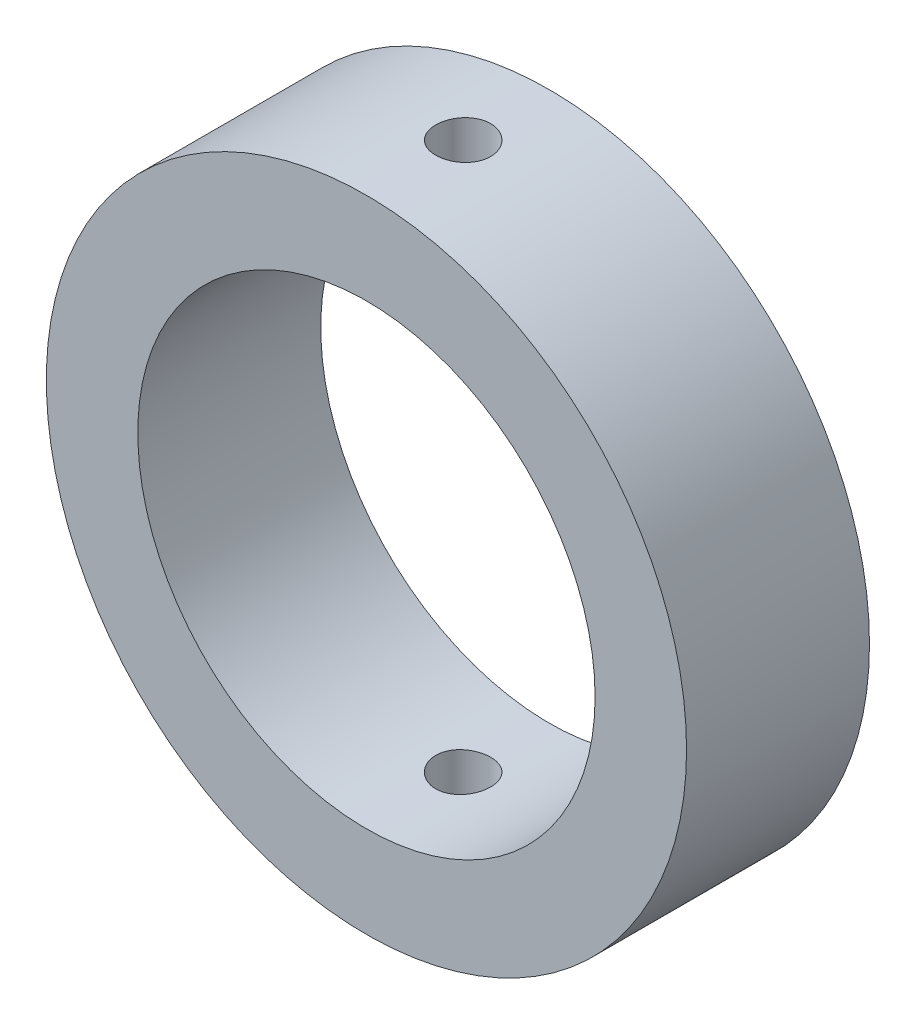
ISO-10303-21;
HEADER;
FILE_DESCRIPTION(('STEP AP214'),'2;1');
FILE_NAME('part.step','',(''),(''),'','','');
FILE_SCHEMA(('AUTOMOTIVE_DESIGN { 1 0 10303 214 1 1 1 1 }'));
ENDSEC;
DATA;
#1=APPLICATION_CONTEXT('core data for automotive mechanical design processes');
#2=APPLICATION_PROTOCOL_DEFINITION('international standard','automotive_design',2000,#1);
#3=PRODUCT_CONTEXT('',#1,'mechanical');
#4=PRODUCT('Part','Part','',(#3));
#5=PRODUCT_RELATED_PRODUCT_CATEGORY('part','',(#4));
#6=PRODUCT_DEFINITION_FORMATION('','',#4);
#7=PRODUCT_DEFINITION_CONTEXT('part definition',#1,'design');
#8=PRODUCT_DEFINITION('design','',#6,#7);
#9=PRODUCT_DEFINITION_SHAPE('','',#8);
#10=(LENGTH_UNIT() NAMED_UNIT(*) SI_UNIT(.MILLI.,.METRE.));
#11=(NAMED_UNIT(*) PLANE_ANGLE_UNIT() SI_UNIT($,.RADIAN.));
#12=(NAMED_UNIT(*) SI_UNIT($,.STERADIAN.) SOLID_ANGLE_UNIT());
#13=UNCERTAINTY_MEASURE_WITH_UNIT(LENGTH_MEASURE(1.E-05),#10,'distance_accuracy_value','');
#14=(GEOMETRIC_REPRESENTATION_CONTEXT(3) GLOBAL_UNCERTAINTY_ASSIGNED_CONTEXT((#13)) GLOBAL_UNIT_ASSIGNED_CONTEXT((#10,
#11,#12)) REPRESENTATION_CONTEXT('',''));
#15=CARTESIAN_POINT('',(0.,0.,0.));
#16=DIRECTION('',(0.,0.,1.));
#17=DIRECTION('',(1.,0.,0.));
#18=AXIS2_PLACEMENT_3D('',#15,#16,#17);
#19=CARTESIAN_POINT('',(0.,0.,20.));
#20=DIRECTION('',(0.,0.,-1.));
#21=DIRECTION('',(-1.,0.,0.));
#22=AXIS2_PLACEMENT_3D('',#19,#20,#21);
#23=CYLINDRICAL_SURFACE('',#22,35.);
#24=CARTESIAN_POINT('',(0.,0.,20.));
#25=DIRECTION('',(0.,0.,1.));
#26=DIRECTION('',(1.,0.,0.));
#27=AXIS2_PLACEMENT_3D('',#24,#25,#26);
#28=CIRCLE('',#27,35.);
#29=CARTESIAN_POINT('',(35.,0.,20.));
#30=VERTEX_POINT('',#29);
#31=EDGE_CURVE('E11',#30,#30,#28,.T.);
#32=ORIENTED_EDGE('',*,*,#31,.F.);
#33=EDGE_LOOP('',(#32));
#34=FACE_BOUND('',#33,.T.);
#35=CARTESIAN_POINT('',(0.,0.,0.));
#36=DIRECTION('',(0.,0.,1.));
#37=DIRECTION('',(1.,0.,0.));
#38=AXIS2_PLACEMENT_3D('',#35,#36,#37);
#39=CIRCLE('',#38,35.);
#40=CARTESIAN_POINT('',(35.,0.,0.));
#41=VERTEX_POINT('',#40);
#42=EDGE_CURVE('E69',#41,#41,#39,.T.);
#43=ORIENTED_EDGE('',*,*,#42,.T.);
#44=EDGE_LOOP('',(#43));
#45=FACE_BOUND('',#44,.T.);
#46=CARTESIAN_POINT('',(0.,-35.,6.42415591280614));
#47=CARTESIAN_POINT('',(0.168180177421425,-34.9999983189466,6.42416325069751));
#48=CARTESIAN_POINT('',(0.336474410694065,-34.9987748870089,6.43834577509294));
#49=CARTESIAN_POINT('',(0.668405276387218,-34.9940120055983,6.49471314657702));
#50=CARTESIAN_POINT('',(0.83203643352241,-34.9904699418268,6.53692960319824));
#51=CARTESIAN_POINT('',(1.14978580604665,-34.9814700099417,6.64813398195727));
#52=CARTESIAN_POINT('',(1.30390939390644,-34.9760132356579,6.71710662127546));
#53=CARTESIAN_POINT('',(1.5983553572425,-34.9637955952331,6.87983782876435));
#54=CARTESIAN_POINT('',(1.7386806487592,-34.9570350055299,6.97359114443867));
#55=CARTESIAN_POINT('',(2.00196024172095,-34.9429478698077,7.18349420175544));
#56=CARTESIAN_POINT('',(2.12487233650439,-34.9356200130702,7.29969679960563));
#57=CARTESIAN_POINT('',(2.34947428548936,-34.9212352148941,7.55108800216207));
#58=CARTESIAN_POINT('',(2.45116320107853,-34.9141782854488,7.68627744613488));
#59=CARTESIAN_POINT('',(2.63057608789142,-34.9011203668809,7.97206167374878));
#60=CARTESIAN_POINT('',(2.70826279885841,-34.895121025662,8.12267993080539));
#61=CARTESIAN_POINT('',(2.83722803822898,-34.8848727505605,8.43488280862855));
#62=CARTESIAN_POINT('',(2.88850705745045,-34.8806237841455,8.596467225513));
#63=CARTESIAN_POINT('',(2.96307845769353,-34.8743684880487,8.92559155709542));
#64=CARTESIAN_POINT('',(2.98643979537529,-34.8723566335604,9.09311574119376));
#65=CARTESIAN_POINT('',(3.00472573441206,-34.8707859372111,9.42971859713631));
#66=CARTESIAN_POINT('',(2.99965089755265,-34.8712270468893,9.59879723820475));
#67=CARTESIAN_POINT('',(2.96126551313284,-34.874507414771,9.93323656271367));
#68=CARTESIAN_POINT('',(2.92802995365881,-34.8773403039272,10.0986059241451));
#69=CARTESIAN_POINT('',(2.83438308452453,-34.8850750500347,10.4214104140507));
#70=CARTESIAN_POINT('',(2.77397149596722,-34.8899769282191,10.5788454610795));
#71=CARTESIAN_POINT('',(2.62760362876988,-34.9013046627491,10.8815510151968));
#72=CARTESIAN_POINT('',(2.54161375570937,-34.9077325210554,11.0268052003468));
#73=CARTESIAN_POINT('',(2.34655446417304,-34.9213861292491,11.3008472889814));
#74=CARTESIAN_POINT('',(2.23748455081154,-34.9286118962437,11.4296348392909));
#75=CARTESIAN_POINT('',(1.99894091774494,-34.9430754969892,11.66752383457));
#76=CARTESIAN_POINT('',(1.86940237855328,-34.9503132942366,11.7765602944748));
#77=CARTESIAN_POINT('',(1.59382461581758,-34.9639632077666,11.9713493498836));
#78=CARTESIAN_POINT('',(1.44778538038973,-34.9703753234546,12.0571019286184));
#79=CARTESIAN_POINT('',(1.14330913680171,-34.9816527329005,12.2028851647052));
#80=CARTESIAN_POINT('',(0.984870717201057,-34.9865178502383,12.2629128886599));
#81=CARTESIAN_POINT('',(0.660113221128349,-34.9941511080319,12.355496669461));
#82=CARTESIAN_POINT('',(0.493794317781496,-34.9969192945321,12.38805332952));
#83=CARTESIAN_POINT('',(0.15856025083397,-35.0000408811528,12.424689214896));
#84=CARTESIAN_POINT('',(-0.0103450366761312,-35.0004018916599,12.4288581899445));
#85=CARTESIAN_POINT('',(-0.34645210448266,-34.9986887867208,12.4088355570408));
#86=CARTESIAN_POINT('',(-0.513653901587616,-34.9966146953254,12.3846442291968));
#87=CARTESIAN_POINT('',(-0.841351421558966,-34.9902695086844,12.3086620904697));
#88=CARTESIAN_POINT('',(-1.00185687270474,-34.9860017297263,12.2569129356431));
#89=CARTESIAN_POINT('',(-1.31190702245475,-34.9757485102754,12.1273266927405));
#90=CARTESIAN_POINT('',(-1.46145153801856,-34.9697630411066,12.0494891691268));
#91=CARTESIAN_POINT('',(-1.7457428816744,-34.9567262474856,11.8697105598614));
#92=CARTESIAN_POINT('',(-1.88045202960912,-34.9496723123826,11.7677100812794));
#93=CARTESIAN_POINT('',(-2.13086824169311,-34.9352996751561,11.5425866928816));
#94=CARTESIAN_POINT('',(-2.24657495644839,-34.9279809681673,11.41946339477));
#95=CARTESIAN_POINT('',(-2.45601016602155,-34.9138810732733,11.155199643067));
#96=CARTESIAN_POINT('',(-2.54968004901865,-34.9071013498897,11.0140126492438));
#97=CARTESIAN_POINT('',(-2.71198063229128,-34.8948680127784,10.7178606677842));
#98=CARTESIAN_POINT('',(-2.78061159495576,-34.8894143851545,10.5628958245504));
#99=CARTESIAN_POINT('',(-2.8907865424564,-34.8804590783594,10.2437937016821));
#100=CARTESIAN_POINT('',(-2.93236627395852,-34.8769548240937,10.0796688393621));
#101=CARTESIAN_POINT('',(-2.98737479633476,-34.872286503041,9.74673585542827));
#102=CARTESIAN_POINT('',(-3.0008041627162,-34.871122388412,9.57792782962881));
#103=CARTESIAN_POINT('',(-2.99912392353084,-34.8712668950776,9.2410028480158));
#104=CARTESIAN_POINT('',(-2.98410640669543,-34.8725675374249,9.0728854218772));
#105=CARTESIAN_POINT('',(-2.92615085557176,-34.8774780477604,8.74156998535792));
#106=CARTESIAN_POINT('',(-2.88321277999482,-34.8810879191635,8.57837198225242));
#107=CARTESIAN_POINT('',(-2.7706585792072,-34.8902080316544,8.26152289123225));
#108=CARTESIAN_POINT('',(-2.70104425727074,-34.8957181442861,8.10787115881974));
#109=CARTESIAN_POINT('',(-2.53712384137618,-34.9080181097009,7.81442033700872));
#110=CARTESIAN_POINT('',(-2.4428181018962,-34.9148079441114,7.67462104877967));
#111=CARTESIAN_POINT('',(-2.23184571903132,-34.9289284828144,7.41237206686649));
#112=CARTESIAN_POINT('',(-2.11511080731054,-34.9362607952504,7.28997737978921));
#113=CARTESIAN_POINT('',(-1.86271960746937,-34.9506254222313,7.06646788603913));
#114=CARTESIAN_POINT('',(-1.72705875414518,-34.9576576638589,6.96535822842324));
#115=CARTESIAN_POINT('',(-1.44039065385252,-34.9706432183249,6.78714508436481));
#116=CARTESIAN_POINT('',(-1.28935405311577,-34.9765944046818,6.7100887024606));
#117=CARTESIAN_POINT('',(-0.976537475486435,-34.9867226680456,6.5825291351389));
#118=CARTESIAN_POINT('',(-0.814770058056751,-34.9909017781752,6.53199550395541));
#119=CARTESIAN_POINT('',(-0.543377751492648,-34.9959451685553,6.47175041849901));
#120=CARTESIAN_POINT('',(-0.435496910992703,-34.9974587860022,6.45392628835298));
#121=CARTESIAN_POINT('',(-0.218426750644095,-34.9994867462511,6.43012666923955));
#122=CARTESIAN_POINT('',(-0.109237434508939,-35.0000010918883,6.42415114665331));
#123=CARTESIAN_POINT('',(0.,-35.,6.42415591280614));
#124=B_SPLINE_CURVE_WITH_KNOTS('',3,(#46,#47,#48,#49,#50,#51,#52,#53,#54,#55,#56,#57,#58,#59,
#60,#61,#62,#63,#64,#65,#66,#67,#68,#69,#70,#71,#72,#73,#74,#75,#76,#77,#78,#79,#80,#81,#82,#83,
#84,#85,#86,#87,#88,#89,#90,#91,#92,#93,#94,#95,#96,#97,#98,#99,#100,#101,#102,#103,#104,#105,
#106,#107,#108,#109,#110,#111,#112,#113,#114,#115,#116,#117,#118,#119,#120,#121,#122,#123),
.UNSPECIFIED.,.T.,.F.,(4,2,2,2,2,2,2,2,2,2,2,2,2,2,2,2,2,2,2,2,2,2,2,2,2,2,2,2,2,2,2,2,2,2,2,2,
2,2,4),(0.,0.504141688620748,1.0088527873041,1.51327602436422,2.01759242981481,2.5231110330061,
3.0286519884333,3.53497383147415,4.04128626359052,4.54634550220951,5.05139476290399,
5.55510335902216,6.05881712462465,6.56319540924795,7.06758450992202,7.57360414720597,
8.07962414892789,8.58570183661506,9.09176841150508,9.59623427417642,10.1006951543972,
10.6043956535469,11.1081045622491,11.6130646830275,12.1180340873687,12.6243317573245,
13.1306241215114,13.636246082805,14.1418577070399,14.6458353534655,15.1498137451707,
15.6537580747011,16.1576951698375,16.6631911333163,17.1688092410494,17.6754113983993,
18.1814307424438,18.5088849156758,18.8363381597995),.UNSPECIFIED.);
#125=CARTESIAN_POINT('',(0.,-35.,6.42415591280614));
#126=VERTEX_POINT('',#125);
#127=EDGE_CURVE('E106',#126,#126,#124,.T.);
#128=ORIENTED_EDGE('',*,*,#127,.F.);
#129=EDGE_LOOP('',(#128));
#130=FACE_BOUND('',#129,.T.);
#131=CARTESIAN_POINT('',(0.,35.,6.42415591280614));
#132=CARTESIAN_POINT('',(-0.168180177421425,34.9999983189466,6.42416325069751));
#133=CARTESIAN_POINT('',(-0.336474410694065,34.9987748870089,6.43834577509294));
#134=CARTESIAN_POINT('',(-0.668405276387218,34.9940120055983,6.49471314657702));
#135=CARTESIAN_POINT('',(-0.832036433522409,34.9904699418268,6.53692960319824));
#136=CARTESIAN_POINT('',(-1.14978580604665,34.9814700099417,6.64813398195727));
#137=CARTESIAN_POINT('',(-1.30390939390644,34.9760132356579,6.71710662127546));
#138=CARTESIAN_POINT('',(-1.5983553572425,34.9637955952331,6.87983782876435));
#139=CARTESIAN_POINT('',(-1.7386806487592,34.9570350055299,6.97359114443867));
#140=CARTESIAN_POINT('',(-2.00196024172095,34.9429478698077,7.18349420175544));
#141=CARTESIAN_POINT('',(-2.12487233650439,34.9356200130702,7.29969679960563));
#142=CARTESIAN_POINT('',(-2.34947428548936,34.9212352148941,7.55108800216207));
#143=CARTESIAN_POINT('',(-2.45116320107853,34.9141782854488,7.68627744613488));
#144=CARTESIAN_POINT('',(-2.63057608789142,34.9011203668809,7.97206167374878));
#145=CARTESIAN_POINT('',(-2.70826279885841,34.895121025662,8.12267993080538));
#146=CARTESIAN_POINT('',(-2.83722803822897,34.8848727505605,8.43488280862855));
#147=CARTESIAN_POINT('',(-2.88850705745045,34.8806237841455,8.596467225513));
#148=CARTESIAN_POINT('',(-2.96307845769353,34.8743684880487,8.92559155709542));
#149=CARTESIAN_POINT('',(-2.98643979537529,34.8723566335604,9.09311574119376));
#150=CARTESIAN_POINT('',(-3.00472573441206,34.8707859372111,9.42971859713631));
#151=CARTESIAN_POINT('',(-2.99965089755265,34.8712270468893,9.59879723820475));
#152=CARTESIAN_POINT('',(-2.96126551313284,34.874507414771,9.93323656271367));
#153=CARTESIAN_POINT('',(-2.92802995365881,34.8773403039272,10.0986059241451));
#154=CARTESIAN_POINT('',(-2.83438308452453,34.8850750500347,10.4214104140507));
#155=CARTESIAN_POINT('',(-2.77397149596722,34.8899769282191,10.5788454610795));
#156=CARTESIAN_POINT('',(-2.62760362876988,34.9013046627491,10.8815510151968));
#157=CARTESIAN_POINT('',(-2.54161375570937,34.9077325210554,11.0268052003468));
#158=CARTESIAN_POINT('',(-2.34655446417304,34.9213861292491,11.3008472889814));
#159=CARTESIAN_POINT('',(-2.23748455081154,34.9286118962437,11.4296348392909));
#160=CARTESIAN_POINT('',(-1.99894091774494,34.9430754969892,11.66752383457));
#161=CARTESIAN_POINT('',(-1.86940237855328,34.9503132942366,11.7765602944748));
#162=CARTESIAN_POINT('',(-1.59382461581758,34.9639632077666,11.9713493498836));
#163=CARTESIAN_POINT('',(-1.44778538038973,34.9703753234546,12.0571019286184));
#164=CARTESIAN_POINT('',(-1.1433091368017,34.9816527329005,12.2028851647052));
#165=CARTESIAN_POINT('',(-0.984870717201056,34.9865178502383,12.2629128886599));
#166=CARTESIAN_POINT('',(-0.660113221128348,34.9941511080319,12.355496669461));
#167=CARTESIAN_POINT('',(-0.493794317781495,34.9969192945321,12.38805332952));
#168=CARTESIAN_POINT('',(-0.158560250833969,35.0000408811528,12.424689214896));
#169=CARTESIAN_POINT('',(0.0103450366761311,35.0004018916599,12.4288581899445));
#170=CARTESIAN_POINT('',(0.34645210448266,34.9986887867208,12.4088355570408));
#171=CARTESIAN_POINT('',(0.513653901587616,34.9966146953254,12.3846442291968));
#172=CARTESIAN_POINT('',(0.841351421558967,34.9902695086844,12.3086620904697));
#173=CARTESIAN_POINT('',(1.00185687270474,34.9860017297263,12.2569129356431));
#174=CARTESIAN_POINT('',(1.31190702245476,34.9757485102754,12.1273266927405));
#175=CARTESIAN_POINT('',(1.46145153801856,34.9697630411066,12.0494891691268));
#176=CARTESIAN_POINT('',(1.7457428816744,34.9567262474856,11.8697105598614));
#177=CARTESIAN_POINT('',(1.88045202960912,34.9496723123826,11.7677100812794));
#178=CARTESIAN_POINT('',(2.13086824169311,34.9352996751561,11.5425866928816));
#179=CARTESIAN_POINT('',(2.24657495644839,34.9279809681673,11.41946339477));
#180=CARTESIAN_POINT('',(2.45601016602155,34.9138810732733,11.155199643067));
#181=CARTESIAN_POINT('',(2.54968004901865,34.9071013498897,11.0140126492438));
#182=CARTESIAN_POINT('',(2.71198063229128,34.8948680127784,10.7178606677842));
#183=CARTESIAN_POINT('',(2.78061159495576,34.8894143851545,10.5628958245504));
#184=CARTESIAN_POINT('',(2.8907865424564,34.8804590783594,10.2437937016821));
#185=CARTESIAN_POINT('',(2.93236627395852,34.8769548240937,10.0796688393621));
#186=CARTESIAN_POINT('',(2.98737479633476,34.872286503041,9.74673585542827));
#187=CARTESIAN_POINT('',(3.0008041627162,34.871122388412,9.57792782962881));
#188=CARTESIAN_POINT('',(2.99912392353084,34.8712668950776,9.2410028480158));
#189=CARTESIAN_POINT('',(2.98410640669543,34.8725675374249,9.0728854218772));
#190=CARTESIAN_POINT('',(2.92615085557176,34.8774780477604,8.74156998535792));
#191=CARTESIAN_POINT('',(2.88321277999482,34.8810879191635,8.57837198225241));
#192=CARTESIAN_POINT('',(2.7706585792072,34.8902080316544,8.26152289123225));
#193=CARTESIAN_POINT('',(2.70104425727074,34.8957181442861,8.10787115881974));
#194=CARTESIAN_POINT('',(2.53712384137618,34.9080181097009,7.81442033700872));
#195=CARTESIAN_POINT('',(2.4428181018962,34.9148079441114,7.67462104877967));
#196=CARTESIAN_POINT('',(2.23184571903132,34.9289284828144,7.41237206686649));
#197=CARTESIAN_POINT('',(2.11511080731054,34.9362607952504,7.28997737978921));
#198=CARTESIAN_POINT('',(1.86271960746937,34.9506254222313,7.06646788603913));
#199=CARTESIAN_POINT('',(1.72705875414518,34.9576576638589,6.96535822842324));
#200=CARTESIAN_POINT('',(1.44039065385252,34.9706432183249,6.78714508436481));
#201=CARTESIAN_POINT('',(1.28935405311577,34.9765944046818,6.7100887024606));
#202=CARTESIAN_POINT('',(0.976537475486436,34.9867226680456,6.5825291351389));
#203=CARTESIAN_POINT('',(0.814770058056751,34.9909017781752,6.53199550395541));
#204=CARTESIAN_POINT('',(0.543377751492647,34.9959451685553,6.47175041849901));
#205=CARTESIAN_POINT('',(0.435496910992702,34.9974587860022,6.45392628835298));
#206=CARTESIAN_POINT('',(0.218426750644094,34.9994867462511,6.43012666923955));
#207=CARTESIAN_POINT('',(0.109237434508939,35.0000010918883,6.42415114665331));
#208=CARTESIAN_POINT('',(0.,35.,6.42415591280614));
#209=B_SPLINE_CURVE_WITH_KNOTS('',3,(#131,#132,#133,#134,#135,#136,#137,#138,#139,#140,#141,
#142,#143,#144,#145,#146,#147,#148,#149,#150,#151,#152,#153,#154,#155,#156,#157,#158,#159,#160,
#161,#162,#163,#164,#165,#166,#167,#168,#169,#170,#171,#172,#173,#174,#175,#176,#177,#178,#179,
#180,#181,#182,#183,#184,#185,#186,#187,#188,#189,#190,#191,#192,#193,#194,#195,#196,#197,#198,
#199,#200,#201,#202,#203,#204,#205,#206,#207,#208),.UNSPECIFIED.,.T.,.F.,(4,2,2,2,2,2,2,2,2,2,2,
2,2,2,2,2,2,2,2,2,2,2,2,2,2,2,2,2,2,2,2,2,2,2,2,2,2,2,4),(0.,0.504141688620747,1.0088527873041,
1.51327602436422,2.01759242981481,2.5231110330061,3.0286519884333,3.53497383147415,
4.04128626359052,4.54634550220951,5.05139476290399,5.55510335902216,6.05881712462465,
6.56319540924795,7.06758450992202,7.57360414720597,8.07962414892789,8.58570183661506,
9.09176841150507,9.59623427417642,10.1006951543972,10.6043956535469,11.1081045622491,
11.6130646830275,12.1180340873686,12.6243317573245,13.1306241215114,13.636246082805,
14.1418577070399,14.6458353534655,15.1498137451707,15.6537580747011,16.1576951698375,
16.6631911333163,17.1688092410494,17.6754113983993,18.1814307424438,18.5088849156758,
18.8363381597995),.UNSPECIFIED.);
#210=CARTESIAN_POINT('',(0.,35.,6.42415591280614));
#211=VERTEX_POINT('',#210);
#212=EDGE_CURVE('E100',#211,#211,#209,.T.);
#213=ORIENTED_EDGE('',*,*,#212,.F.);
#214=EDGE_LOOP('',(#213));
#215=FACE_BOUND('',#214,.T.);
#216=ADVANCED_FACE('F55',(#34,#45,#130,#215),#23,.T.);
#217=CARTESIAN_POINT('',(0.,0.,20.));
#218=DIRECTION('',(0.,0.,-1.));
#219=DIRECTION('',(-1.,0.,0.));
#220=AXIS2_PLACEMENT_3D('',#217,#218,#219);
#221=CYLINDRICAL_SURFACE('',#220,25.);
#222=CARTESIAN_POINT('',(0.,-25.,6.42415591280614));
#223=CARTESIAN_POINT('',(0.167864047107699,-24.9999977357459,6.42416307674757));
#224=CARTESIAN_POINT('',(0.335834317331191,-24.9982914200408,6.43829257149882));
#225=CARTESIAN_POINT('',(0.66710457130825,-24.991648705422,6.49443697696152));
#226=CARTESIAN_POINT('',(0.830399429590069,-24.9867088933728,6.53648135405672));
#227=CARTESIAN_POINT('',(1.14747479534053,-24.9741559265426,6.64720218933215));
#228=CARTESIAN_POINT('',(1.30126148759225,-24.9665445315309,6.71586111963031));
#229=CARTESIAN_POINT('',(1.595099157832,-24.9494959264345,6.87782464788944));
#230=CARTESIAN_POINT('',(1.73515256713516,-24.9400590404141,6.97112487255945));
#231=CARTESIAN_POINT('',(1.99829131534451,-24.920360105442,7.18023077478138));
#232=CARTESIAN_POINT('',(2.1212966913072,-24.9100945030904,7.29613675291805));
#233=CARTESIAN_POINT('',(2.34615931038342,-24.8899239397152,7.54694887769403));
#234=CARTESIAN_POINT('',(2.44801549826474,-24.8800189967068,7.68185597182478));
#235=CARTESIAN_POINT('',(2.62798342873896,-24.8616560370405,7.96735673810452));
#236=CARTESIAN_POINT('',(2.7060207567257,-24.8532025903971,8.11799763738627));
#237=CARTESIAN_POINT('',(2.8356605730156,-24.8387461344686,8.43036461491488));
#238=CARTESIAN_POINT('',(2.88726398696776,-24.8327430393798,8.59209030477544));
#239=CARTESIAN_POINT('',(2.96232930045399,-24.8239006073737,8.92120877211756));
#240=CARTESIAN_POINT('',(2.98592577987646,-24.8210461452543,9.08857044123381));
#241=CARTESIAN_POINT('',(3.0047237521967,-24.8187777690611,9.4249008491703));
#242=CARTESIAN_POINT('',(2.99992630052848,-24.8193637271033,9.5938695280231));
#243=CARTESIAN_POINT('',(2.96218316078668,-24.8238961466306,9.92768187759049));
#244=CARTESIAN_POINT('',(2.92938543222303,-24.8278249434675,10.0925425514863));
#245=CARTESIAN_POINT('',(2.83680346170067,-24.8385728087608,10.4144029406275));
#246=CARTESIAN_POINT('',(2.77701871225814,-24.8453919315688,10.5714025079851));
#247=CARTESIAN_POINT('',(2.63199980699862,-24.8611722079476,10.8735453810452));
#248=CARTESIAN_POINT('',(2.54670106203925,-24.8701387862198,11.0186573911597));
#249=CARTESIAN_POINT('',(2.35312173169469,-24.8891993987901,11.2925631237219));
#250=CARTESIAN_POINT('',(2.24484017723157,-24.8992934806213,11.4213561577087));
#251=CARTESIAN_POINT('',(2.0075475556218,-24.9195503308637,11.6598269971705));
#252=CARTESIAN_POINT('',(1.87840890051216,-24.929713127424,11.7693778826632));
#253=CARTESIAN_POINT('',(1.60350795893872,-24.9489020798549,11.9652674338064));
#254=CARTESIAN_POINT('',(1.45774563908005,-24.9579282334421,12.0516060528253));
#255=CARTESIAN_POINT('',(1.15363930826284,-24.9738318861702,12.1986191984458));
#256=CARTESIAN_POINT('',(0.99529157871559,-24.9807087472809,12.2592861061366));
#257=CARTESIAN_POINT('',(0.670556022273439,-24.991533065309,12.353134650657));
#258=CARTESIAN_POINT('',(0.504168542441623,-24.9954806485584,12.3863174728106));
#259=CARTESIAN_POINT('',(0.169174396374217,-24.9999852500304,12.4240921683038));
#260=CARTESIAN_POINT('',(0.000587720432052556,-25.0005630093753,12.4288589452068));
#261=CARTESIAN_POINT('',(-0.334982068243259,-24.9983187823231,12.4101273349379));
#262=CARTESIAN_POINT('',(-0.501965212327328,-24.9954968625308,12.3866295015108));
#263=CARTESIAN_POINT('',(-0.829074263928356,-24.9867833380686,12.312180948803));
#264=CARTESIAN_POINT('',(-0.989219346369033,-24.9809010237909,12.2613132997561));
#265=CARTESIAN_POINT('',(-1.29870539768646,-24.9667255501792,12.1336552094526));
#266=CARTESIAN_POINT('',(-1.44804602592347,-24.9584323148759,12.056863951316));
#267=CARTESIAN_POINT('',(-1.73246717766504,-24.9403085158695,11.8791129969037));
#268=CARTESIAN_POINT('',(-1.86747628962751,-24.9304708084643,11.7780397749953));
#269=CARTESIAN_POINT('',(-2.11867625152203,-24.9103817919419,11.554755066398));
#270=CARTESIAN_POINT('',(-2.23486641472949,-24.9001304677484,11.4325428086582));
#271=CARTESIAN_POINT('',(-2.44574795226154,-24.8803059484942,11.1696802973785));
#272=CARTESIAN_POINT('',(-2.54032363231939,-24.8707365831307,11.0289368974623));
#273=CARTESIAN_POINT('',(-2.70449314429332,-24.8534214993383,10.7334608877306));
#274=CARTESIAN_POINT('',(-2.77408744356074,-24.8456757467943,10.5787285396879));
#275=CARTESIAN_POINT('',(-2.88612996668159,-24.8329105734502,10.2600453039114));
#276=CARTESIAN_POINT('',(-2.92864420159346,-24.8278845275633,10.0961179009467));
#277=CARTESIAN_POINT('',(-2.98553272163516,-24.8211085274587,9.76338694332107));
#278=CARTESIAN_POINT('',(-2.99990820526081,-24.8193584337106,9.59458359664881));
#279=CARTESIAN_POINT('',(-3.00009033817931,-24.819336326607,9.25804318316896));
#280=CARTESIAN_POINT('',(-2.98607873671351,-24.8210421863943,9.09030618703487));
#281=CARTESIAN_POINT('',(-2.93026848672089,-24.8276922947425,8.75958912641197));
#282=CARTESIAN_POINT('',(-2.88846982822067,-24.8326365444656,8.59660906363055));
#283=CARTESIAN_POINT('',(-2.77832739820545,-24.8451996524586,8.28005137391744));
#284=CARTESIAN_POINT('',(-2.70999165570539,-24.8528177016812,8.12647091931065));
#285=CARTESIAN_POINT('',(-2.5487328262801,-24.8698714539139,7.83292816573604));
#286=CARTESIAN_POINT('',(-2.45580952709445,-24.8793071726153,7.69296598434683));
#287=CARTESIAN_POINT('',(-2.24733689647205,-24.8990055122588,7.4297029726973));
#288=CARTESIAN_POINT('',(-2.1316520393015,-24.9092728581347,7.30650980953986));
#289=CARTESIAN_POINT('',(-1.88122093334447,-24.9294354968169,7.08121343324013));
#290=CARTESIAN_POINT('',(-1.74647018263601,-24.939330701051,6.97911521517694));
#291=CARTESIAN_POINT('',(-1.46119322465137,-24.9576721709324,6.79860533480728));
#292=CARTESIAN_POINT('',(-1.31061323462418,-24.966113221621,6.72027818708385));
#293=CARTESIAN_POINT('',(-0.998422751685313,-24.9805418519727,6.59013214836356));
#294=CARTESIAN_POINT('',(-0.836824564362145,-24.9865321180615,6.53828421662575));
#295=CARTESIAN_POINT('',(-0.561977101236697,-24.9939268325999,6.47509249246802));
#296=CARTESIAN_POINT('',(-0.450466569753487,-24.996193279433,6.45601842891976));
#297=CARTESIAN_POINT('',(-0.225986735693695,-24.9992306204204,6.43054776931517));
#298=CARTESIAN_POINT('',(-0.113017442753625,-25.0000015244492,6.42415108955568));
#299=CARTESIAN_POINT('',(0.,-25.,6.42415591280614));
#300=B_SPLINE_CURVE_WITH_KNOTS('',3,(#222,#223,#224,#225,#226,#227,#228,#229,#230,#231,#232,
#233,#234,#235,#236,#237,#238,#239,#240,#241,#242,#243,#244,#245,#246,#247,#248,#249,#250,#251,
#252,#253,#254,#255,#256,#257,#258,#259,#260,#261,#262,#263,#264,#265,#266,#267,#268,#269,#270,
#271,#272,#273,#274,#275,#276,#277,#278,#279,#280,#281,#282,#283,#284,#285,#286,#287,#288,#289,
#290,#291,#292,#293,#294,#295,#296,#297,#298,#299),.UNSPECIFIED.,.T.,.F.,(4,2,2,2,2,2,2,2,2,2,2,
2,2,2,2,2,2,2,2,2,2,2,2,2,2,2,2,2,2,2,2,2,2,2,2,2,2,2,4),(0.,0.503179350956159,1.00689069408623,
1.5102708637556,2.01356175441693,2.51913872195878,3.02474090904883,3.53190689496397,
4.03905511999114,4.54375638343279,5.0484388866848,5.55047092912253,6.05251241253396,
6.55583573710536,7.05918028869262,7.56572944640317,8.07227962172601,8.57898002694279,
9.08565857822619,9.58921522624226,10.0927620090108,10.5947890255775,11.0968318630167,
11.6012692178556,12.1057249760356,12.6128207581672,13.119907053063,13.6257524826489,
14.1315763666154,14.6341719319229,15.1367676776234,15.6392114771388,16.1416596143121,
16.6471952402032,17.1528504352009,17.6602829023946,18.1671576479275,18.5059342945627,
18.8447087043981),.UNSPECIFIED.);
#301=CARTESIAN_POINT('',(0.,-25.,6.42415591280614));
#302=VERTEX_POINT('',#301);
#303=EDGE_CURVE('E80',#302,#302,#300,.T.);
#304=ORIENTED_EDGE('',*,*,#303,.T.);
#305=EDGE_LOOP('',(#304));
#306=FACE_BOUND('',#305,.T.);
#307=CARTESIAN_POINT('',(0.,0.,20.));
#308=DIRECTION('',(0.,0.,1.));
#309=DIRECTION('',(1.,0.,0.));
#310=AXIS2_PLACEMENT_3D('',#307,#308,#309);
#311=CIRCLE('',#310,25.);
#312=CARTESIAN_POINT('',(25.,0.,20.));
#313=VERTEX_POINT('',#312);
#314=EDGE_CURVE('E75',#313,#313,#311,.T.);
#315=ORIENTED_EDGE('',*,*,#314,.T.);
#316=EDGE_LOOP('',(#315));
#317=FACE_BOUND('',#316,.T.);
#318=CARTESIAN_POINT('',(0.,0.,0.));
#319=DIRECTION('',(0.,0.,1.));
#320=DIRECTION('',(1.,0.,0.));
#321=AXIS2_PLACEMENT_3D('',#318,#319,#320);
#322=CIRCLE('',#321,25.);
#323=CARTESIAN_POINT('',(25.,0.,0.));
#324=VERTEX_POINT('',#323);
#325=EDGE_CURVE('E78',#324,#324,#322,.T.);
#326=ORIENTED_EDGE('',*,*,#325,.F.);
#327=EDGE_LOOP('',(#326));
#328=FACE_BOUND('',#327,.T.);
#329=CARTESIAN_POINT('',(0.,25.,6.42415591280614));
#330=CARTESIAN_POINT('',(-0.167864047107699,24.9999977357459,6.42416307674757));
#331=CARTESIAN_POINT('',(-0.335834317331191,24.9982914200408,6.43829257149882));
#332=CARTESIAN_POINT('',(-0.66710457130825,24.991648705422,6.49443697696152));
#333=CARTESIAN_POINT('',(-0.830399429590069,24.9867088933728,6.53648135405672));
#334=CARTESIAN_POINT('',(-1.14747479534053,24.9741559265426,6.64720218933215));
#335=CARTESIAN_POINT('',(-1.30126148759225,24.9665445315309,6.71586111963031));
#336=CARTESIAN_POINT('',(-1.595099157832,24.9494959264345,6.87782464788944));
#337=CARTESIAN_POINT('',(-1.73515256713516,24.9400590404141,6.97112487255945));
#338=CARTESIAN_POINT('',(-1.99829131534451,24.920360105442,7.18023077478138));
#339=CARTESIAN_POINT('',(-2.1212966913072,24.9100945030904,7.29613675291805));
#340=CARTESIAN_POINT('',(-2.34615931038342,24.8899239397152,7.54694887769403));
#341=CARTESIAN_POINT('',(-2.44801549826474,24.8800189967068,7.68185597182478));
#342=CARTESIAN_POINT('',(-2.62798342873896,24.8616560370405,7.96735673810452));
#343=CARTESIAN_POINT('',(-2.7060207567257,24.8532025903971,8.11799763738627));
#344=CARTESIAN_POINT('',(-2.8356605730156,24.8387461344686,8.43036461491488));
#345=CARTESIAN_POINT('',(-2.88726398696776,24.8327430393798,8.59209030477544));
#346=CARTESIAN_POINT('',(-2.96232930045399,24.8239006073737,8.92120877211756));
#347=CARTESIAN_POINT('',(-2.98592577987646,24.8210461452543,9.08857044123381));
#348=CARTESIAN_POINT('',(-3.0047237521967,24.8187777690611,9.4249008491703));
#349=CARTESIAN_POINT('',(-2.99992630052848,24.8193637271033,9.5938695280231));
#350=CARTESIAN_POINT('',(-2.96218316078668,24.8238961466306,9.92768187759049));
#351=CARTESIAN_POINT('',(-2.92938543222303,24.8278249434675,10.0925425514863));
#352=CARTESIAN_POINT('',(-2.83680346170067,24.8385728087608,10.4144029406275));
#353=CARTESIAN_POINT('',(-2.77701871225814,24.8453919315688,10.5714025079851));
#354=CARTESIAN_POINT('',(-2.63199980699862,24.8611722079476,10.8735453810452));
#355=CARTESIAN_POINT('',(-2.54670106203925,24.8701387862198,11.0186573911597));
#356=CARTESIAN_POINT('',(-2.35312173169469,24.8891993987901,11.2925631237219));
#357=CARTESIAN_POINT('',(-2.24484017723157,24.8992934806213,11.4213561577087));
#358=CARTESIAN_POINT('',(-2.0075475556218,24.9195503308637,11.6598269971705));
#359=CARTESIAN_POINT('',(-1.87840890051216,24.929713127424,11.7693778826632));
#360=CARTESIAN_POINT('',(-1.60350795893872,24.9489020798549,11.9652674338064));
#361=CARTESIAN_POINT('',(-1.45774563908005,24.9579282334421,12.0516060528253));
#362=CARTESIAN_POINT('',(-1.15363930826284,24.9738318861702,12.1986191984458));
#363=CARTESIAN_POINT('',(-0.99529157871559,24.9807087472809,12.2592861061366));
#364=CARTESIAN_POINT('',(-0.670556022273439,24.991533065309,12.353134650657));
#365=CARTESIAN_POINT('',(-0.504168542441623,24.9954806485584,12.3863174728106));
#366=CARTESIAN_POINT('',(-0.169174396374217,24.9999852500304,12.4240921683038));
#367=CARTESIAN_POINT('',(-0.000587720432052556,25.0005630093753,12.4288589452068));
#368=CARTESIAN_POINT('',(0.334982068243259,24.9983187823231,12.4101273349379));
#369=CARTESIAN_POINT('',(0.501965212327328,24.9954968625308,12.3866295015108));
#370=CARTESIAN_POINT('',(0.829074263928356,24.9867833380686,12.312180948803));
#371=CARTESIAN_POINT('',(0.989219346369033,24.9809010237909,12.2613132997561));
#372=CARTESIAN_POINT('',(1.29870539768646,24.9667255501792,12.1336552094526));
#373=CARTESIAN_POINT('',(1.44804602592347,24.9584323148759,12.056863951316));
#374=CARTESIAN_POINT('',(1.73246717766504,24.9403085158695,11.8791129969037));
#375=CARTESIAN_POINT('',(1.86747628962751,24.9304708084643,11.7780397749953));
#376=CARTESIAN_POINT('',(2.11867625152203,24.9103817919419,11.554755066398));
#377=CARTESIAN_POINT('',(2.23486641472949,24.9001304677484,11.4325428086582));
#378=CARTESIAN_POINT('',(2.44574795226154,24.8803059484942,11.1696802973785));
#379=CARTESIAN_POINT('',(2.54032363231939,24.8707365831307,11.0289368974623));
#380=CARTESIAN_POINT('',(2.70449314429332,24.8534214993383,10.7334608877306));
#381=CARTESIAN_POINT('',(2.77408744356074,24.8456757467943,10.5787285396879));
#382=CARTESIAN_POINT('',(2.88612996668159,24.8329105734502,10.2600453039114));
#383=CARTESIAN_POINT('',(2.92864420159346,24.8278845275633,10.0961179009467));
#384=CARTESIAN_POINT('',(2.98553272163516,24.8211085274587,9.76338694332107));
#385=CARTESIAN_POINT('',(2.99990820526081,24.8193584337106,9.59458359664881));
#386=CARTESIAN_POINT('',(3.00009033817931,24.819336326607,9.25804318316896));
#387=CARTESIAN_POINT('',(2.98607873671351,24.8210421863943,9.09030618703487));
#388=CARTESIAN_POINT('',(2.93026848672089,24.8276922947425,8.75958912641197));
#389=CARTESIAN_POINT('',(2.88846982822067,24.8326365444656,8.59660906363055));
#390=CARTESIAN_POINT('',(2.77832739820545,24.8451996524586,8.28005137391744));
#391=CARTESIAN_POINT('',(2.70999165570539,24.8528177016812,8.12647091931065));
#392=CARTESIAN_POINT('',(2.5487328262801,24.8698714539139,7.83292816573604));
#393=CARTESIAN_POINT('',(2.45580952709445,24.8793071726153,7.69296598434683));
#394=CARTESIAN_POINT('',(2.24733689647205,24.8990055122588,7.4297029726973));
#395=CARTESIAN_POINT('',(2.1316520393015,24.9092728581347,7.30650980953986));
#396=CARTESIAN_POINT('',(1.88122093334447,24.9294354968169,7.08121343324013));
#397=CARTESIAN_POINT('',(1.74647018263601,24.939330701051,6.97911521517694));
#398=CARTESIAN_POINT('',(1.46119322465137,24.9576721709324,6.79860533480728));
#399=CARTESIAN_POINT('',(1.31061323462418,24.966113221621,6.72027818708385));
#400=CARTESIAN_POINT('',(0.998422751685313,24.9805418519727,6.59013214836356));
#401=CARTESIAN_POINT('',(0.836824564362145,24.9865321180615,6.53828421662575));
#402=CARTESIAN_POINT('',(0.561977101236697,24.9939268325999,6.47509249246802));
#403=CARTESIAN_POINT('',(0.450466569753487,24.996193279433,6.45601842891976));
#404=CARTESIAN_POINT('',(0.225986735693695,24.9992306204204,6.43054776931517));
#405=CARTESIAN_POINT('',(0.113017442753625,25.0000015244492,6.42415108955568));
#406=CARTESIAN_POINT('',(0.,25.,6.42415591280614));
#407=B_SPLINE_CURVE_WITH_KNOTS('',3,(#329,#330,#331,#332,#333,#334,#335,#336,#337,#338,#339,
#340,#341,#342,#343,#344,#345,#346,#347,#348,#349,#350,#351,#352,#353,#354,#355,#356,#357,#358,
#359,#360,#361,#362,#363,#364,#365,#366,#367,#368,#369,#370,#371,#372,#373,#374,#375,#376,#377,
#378,#379,#380,#381,#382,#383,#384,#385,#386,#387,#388,#389,#390,#391,#392,#393,#394,#395,#396,
#397,#398,#399,#400,#401,#402,#403,#404,#405,#406),.UNSPECIFIED.,.T.,.F.,(4,2,2,2,2,2,2,2,2,2,2,
2,2,2,2,2,2,2,2,2,2,2,2,2,2,2,2,2,2,2,2,2,2,2,2,2,2,2,4),(0.,0.503179350956159,1.00689069408623,
1.5102708637556,2.01356175441693,2.51913872195878,3.02474090904883,3.53190689496397,
4.03905511999114,4.54375638343279,5.0484388866848,5.55047092912253,6.05251241253396,
6.55583573710536,7.05918028869262,7.56572944640317,8.07227962172601,8.57898002694279,
9.08565857822619,9.58921522624226,10.0927620090108,10.5947890255775,11.0968318630167,
11.6012692178556,12.1057249760356,12.6128207581672,13.119907053063,13.6257524826489,
14.1315763666154,14.6341719319229,15.1367676776234,15.6392114771388,16.1416596143121,
16.6471952402032,17.1528504352009,17.6602829023946,18.1671576479275,18.5059342945627,
18.8447087043981),.UNSPECIFIED.);
#408=CARTESIAN_POINT('',(0.,25.,6.42415591280614));
#409=VERTEX_POINT('',#408);
#410=EDGE_CURVE('E59',#409,#409,#407,.T.);
#411=ORIENTED_EDGE('',*,*,#410,.T.);
#412=EDGE_LOOP('',(#411));
#413=FACE_BOUND('',#412,.T.);
#414=ADVANCED_FACE('F86',(#306,#317,#328,#413),#221,.F.);
#415=CARTESIAN_POINT('',(0.,0.,20.));
#416=DIRECTION('',(0.,0.,1.));
#417=DIRECTION('',(1.,0.,0.));
#418=AXIS2_PLACEMENT_3D('',#415,#416,#417);
#419=PLANE('',#418);
#420=ORIENTED_EDGE('',*,*,#31,.T.);
#421=EDGE_LOOP('',(#420));
#422=FACE_BOUND('',#421,.T.);
#423=ORIENTED_EDGE('',*,*,#314,.F.);
#424=EDGE_LOOP('',(#423));
#425=FACE_BOUND('',#424,.T.);
#426=ADVANCED_FACE('F123',(#422,#425),#419,.T.);
#427=CARTESIAN_POINT('',(0.,0.,0.));
#428=DIRECTION('',(0.,0.,1.));
#429=DIRECTION('',(1.,0.,0.));
#430=AXIS2_PLACEMENT_3D('',#427,#428,#429);
#431=PLANE('',#430);
#432=ORIENTED_EDGE('',*,*,#42,.F.);
#433=EDGE_LOOP('',(#432));
#434=FACE_BOUND('',#433,.T.);
#435=ORIENTED_EDGE('',*,*,#325,.T.);
#436=EDGE_LOOP('',(#435));
#437=FACE_BOUND('',#436,.T.);
#438=ADVANCED_FACE('F93',(#434,#437),#431,.F.);
#439=CARTESIAN_POINT('',(0.,42.,9.42415591280614));
#440=DIRECTION('',(0.,-1.,0.));
#441=DIRECTION('',(0.,0.,-1.));
#442=AXIS2_PLACEMENT_3D('',#439,#440,#441);
#443=CYLINDRICAL_SURFACE('',#442,3.);
#444=ORIENTED_EDGE('',*,*,#303,.F.);
#445=EDGE_LOOP('',(#444));
#446=FACE_BOUND('',#445,.T.);
#447=ORIENTED_EDGE('',*,*,#127,.T.);
#448=EDGE_LOOP('',(#447));
#449=FACE_BOUND('',#448,.T.);
#450=ADVANCED_FACE('F89',(#446,#449),#443,.F.);
#451=ORIENTED_EDGE('',*,*,#410,.F.);
#452=EDGE_LOOP('',(#451));
#453=FACE_BOUND('',#452,.T.);
#454=ORIENTED_EDGE('',*,*,#212,.T.);
#455=EDGE_LOOP('',(#454));
#456=FACE_BOUND('',#455,.T.);
#457=ADVANCED_FACE('F92',(#453,#456),#443,.F.);
#458=CLOSED_SHELL('',(#216,#414,#426,#438,#450,#457));
#459=MANIFOLD_SOLID_BREP('B2',#458);
#460=ADVANCED_BREP_SHAPE_REPRESENTATION('',(#18,#459),#14);
#461=SHAPE_DEFINITION_REPRESENTATION(#9,#460);
ENDSEC;
END-ISO-10303-21;
